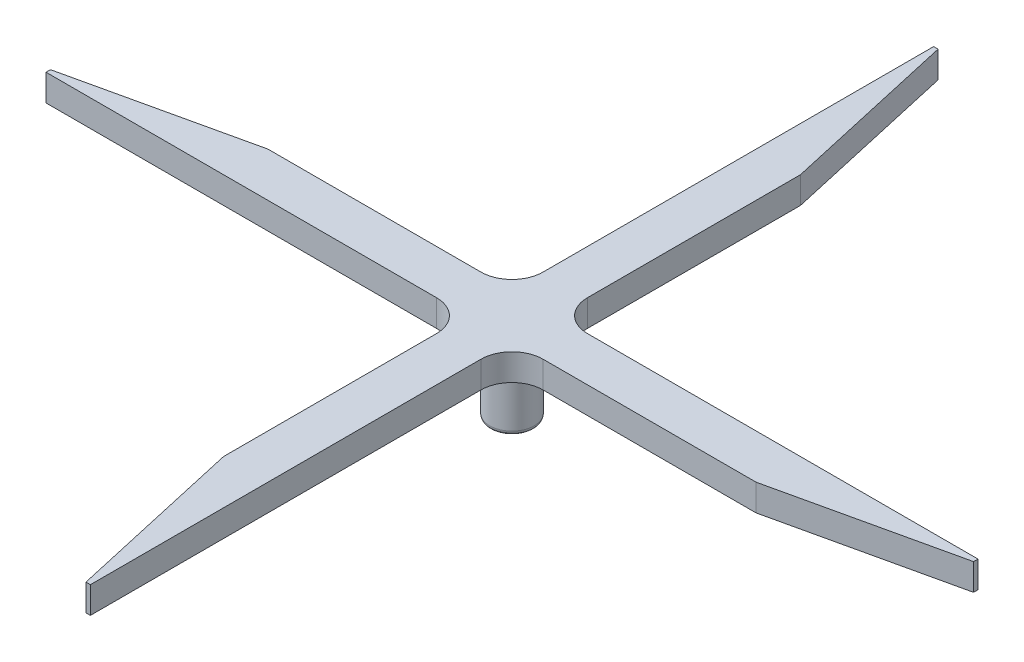
ISO-10303-21;
HEADER;
FILE_DESCRIPTION(('STEP AP214'),'2;1');
FILE_NAME('part.step','',(''),(''),'','','');
FILE_SCHEMA(('AUTOMOTIVE_DESIGN { 1 0 10303 214 1 1 1 1 }'));
ENDSEC;
DATA;
#1=APPLICATION_CONTEXT('core data for automotive mechanical design processes');
#2=APPLICATION_PROTOCOL_DEFINITION('international standard','automotive_design',2000,#1);
#3=PRODUCT_CONTEXT('',#1,'mechanical');
#4=PRODUCT('Part','Part','',(#3));
#5=PRODUCT_RELATED_PRODUCT_CATEGORY('part','',(#4));
#6=PRODUCT_DEFINITION_FORMATION('','',#4);
#7=PRODUCT_DEFINITION_CONTEXT('part definition',#1,'design');
#8=PRODUCT_DEFINITION('design','',#6,#7);
#9=PRODUCT_DEFINITION_SHAPE('','',#8);
#10=(LENGTH_UNIT() NAMED_UNIT(*) SI_UNIT(.MILLI.,.METRE.));
#11=(NAMED_UNIT(*) PLANE_ANGLE_UNIT() SI_UNIT($,.RADIAN.));
#12=(NAMED_UNIT(*) SI_UNIT($,.STERADIAN.) SOLID_ANGLE_UNIT());
#13=UNCERTAINTY_MEASURE_WITH_UNIT(LENGTH_MEASURE(1.E-05),#10,'distance_accuracy_value','');
#14=(GEOMETRIC_REPRESENTATION_CONTEXT(3) GLOBAL_UNCERTAINTY_ASSIGNED_CONTEXT((#13)) GLOBAL_UNIT_ASSIGNED_CONTEXT((#10,
#11,#12)) REPRESENTATION_CONTEXT('',''));
#15=CARTESIAN_POINT('',(0.,0.,0.));
#16=DIRECTION('',(0.,0.,1.));
#17=DIRECTION('',(1.,0.,0.));
#18=AXIS2_PLACEMENT_3D('',#15,#16,#17);
#19=CARTESIAN_POINT('',(-127.,7.62,-6.35));
#20=DIRECTION('',(1.,0.,0.));
#21=DIRECTION('',(0.,0.,-1.));
#22=AXIS2_PLACEMENT_3D('',#19,#20,#21);
#23=PLANE('',#22);
#24=DIRECTION('',(0.,0.,1.));
#25=VECTOR('',#24,1.);
#26=CARTESIAN_POINT('',(-127.,7.62,-6.35));
#27=LINE('',#26,#25);
#28=CARTESIAN_POINT('',(-127.,7.62,5.08000000000007));
#29=VERTEX_POINT('',#28);
#30=CARTESIAN_POINT('',(-127.,7.62,6.35));
#31=VERTEX_POINT('',#30);
#32=EDGE_CURVE('E228',#29,#31,#27,.T.);
#33=ORIENTED_EDGE('',*,*,#32,.F.);
#34=DIRECTION('',(0.,1.,0.));
#35=VECTOR('',#34,1.);
#36=CARTESIAN_POINT('',(-127.,0.,5.08000000000007));
#37=LINE('',#36,#35);
#38=CARTESIAN_POINT('',(-127.,0.,5.08000000000007));
#39=VERTEX_POINT('',#38);
#40=EDGE_CURVE('E647',#39,#29,#37,.T.);
#41=ORIENTED_EDGE('',*,*,#40,.F.);
#42=DIRECTION('',(0.,0.,1.));
#43=VECTOR('',#42,1.);
#44=CARTESIAN_POINT('',(-127.,0.,-6.35));
#45=LINE('',#44,#43);
#46=CARTESIAN_POINT('',(-127.,0.,6.35));
#47=VERTEX_POINT('',#46);
#48=EDGE_CURVE('E591',#39,#47,#45,.T.);
#49=ORIENTED_EDGE('',*,*,#48,.T.);
#50=DIRECTION('',(0.,-1.,0.));
#51=VECTOR('',#50,1.);
#52=CARTESIAN_POINT('',(-127.,7.62,6.35));
#53=LINE('',#52,#51);
#54=EDGE_CURVE('E273',#31,#47,#53,.T.);
#55=ORIENTED_EDGE('',*,*,#54,.F.);
#56=EDGE_LOOP('',(#33,#41,#49,#55));
#57=FACE_BOUND('',#56,.T.);
#58=ADVANCED_FACE('F47',(#57),#23,.F.);
#59=CARTESIAN_POINT('',(-127.,7.62,6.35));
#60=DIRECTION('',(0.,0.,-1.));
#61=DIRECTION('',(-1.,0.,0.));
#62=AXIS2_PLACEMENT_3D('',#59,#60,#61);
#63=PLANE('',#62);
#64=DIRECTION('',(1.,0.,0.));
#65=VECTOR('',#64,1.);
#66=CARTESIAN_POINT('',(-127.,0.,6.35));
#67=LINE('',#66,#65);
#68=CARTESIAN_POINT('',(-15.2400000000001,0.,6.35));
#69=VERTEX_POINT('',#68);
#70=EDGE_CURVE('E594',#47,#69,#67,.T.);
#71=ORIENTED_EDGE('',*,*,#70,.T.);
#72=DIRECTION('',(0.,-1.,0.));
#73=VECTOR('',#72,1.);
#74=CARTESIAN_POINT('',(-15.2400000000001,7.62,6.35));
#75=LINE('',#74,#73);
#76=CARTESIAN_POINT('',(-15.2400000000001,7.62,6.35));
#77=VERTEX_POINT('',#76);
#78=EDGE_CURVE('E269',#77,#69,#75,.T.);
#79=ORIENTED_EDGE('',*,*,#78,.F.);
#80=DIRECTION('',(1.,0.,0.));
#81=VECTOR('',#80,1.);
#82=CARTESIAN_POINT('',(-127.,7.62,6.35));
#83=LINE('',#82,#81);
#84=EDGE_CURVE('E662',#31,#77,#83,.T.);
#85=ORIENTED_EDGE('',*,*,#84,.F.);
#86=ORIENTED_EDGE('',*,*,#54,.T.);
#87=EDGE_LOOP('',(#71,#79,#85,#86));
#88=FACE_BOUND('',#87,.T.);
#89=ADVANCED_FACE('F302',(#88),#63,.F.);
#90=CARTESIAN_POINT('',(-15.24,7.62,15.24));
#91=DIRECTION('',(0.,-1.,0.));
#92=DIRECTION('',(0.,0.,-1.));
#93=AXIS2_PLACEMENT_3D('',#90,#91,#92);
#94=CYLINDRICAL_SURFACE('',#93,8.89);
#95=CARTESIAN_POINT('',(-15.24,0.,15.24));
#96=DIRECTION('',(0.,-1.,0.));
#97=DIRECTION('',(0.,0.,-1.));
#98=AXIS2_PLACEMENT_3D('',#95,#96,#97);
#99=CIRCLE('',#98,8.89);
#100=CARTESIAN_POINT('',(-6.35,0.,15.2400000000001));
#101=VERTEX_POINT('',#100);
#102=EDGE_CURVE('E597',#69,#101,#99,.T.);
#103=ORIENTED_EDGE('',*,*,#102,.T.);
#104=DIRECTION('',(0.,-1.,0.));
#105=VECTOR('',#104,1.);
#106=CARTESIAN_POINT('',(-6.35,7.62,15.2400000000001));
#107=LINE('',#106,#105);
#108=CARTESIAN_POINT('',(-6.35,7.62,15.2400000000001));
#109=VERTEX_POINT('',#108);
#110=EDGE_CURVE('E265',#109,#101,#107,.T.);
#111=ORIENTED_EDGE('',*,*,#110,.F.);
#112=CARTESIAN_POINT('',(-15.24,7.62,15.24));
#113=DIRECTION('',(0.,-1.,0.));
#114=DIRECTION('',(0.,0.,-1.));
#115=AXIS2_PLACEMENT_3D('',#112,#113,#114);
#116=CIRCLE('',#115,8.89);
#117=EDGE_CURVE('E665',#77,#109,#116,.T.);
#118=ORIENTED_EDGE('',*,*,#117,.F.);
#119=ORIENTED_EDGE('',*,*,#78,.T.);
#120=EDGE_LOOP('',(#103,#111,#118,#119));
#121=FACE_BOUND('',#120,.T.);
#122=ADVANCED_FACE('F310',(#121),#94,.F.);
#123=CARTESIAN_POINT('',(-6.35,7.62,15.2400000000001));
#124=DIRECTION('',(1.,0.,0.));
#125=DIRECTION('',(0.,0.,-1.));
#126=AXIS2_PLACEMENT_3D('',#123,#124,#125);
#127=PLANE('',#126);
#128=DIRECTION('',(0.,0.,1.));
#129=VECTOR('',#128,1.);
#130=CARTESIAN_POINT('',(-6.35,0.,15.2400000000001));
#131=LINE('',#130,#129);
#132=CARTESIAN_POINT('',(-6.34999999999999,0.,76.2));
#133=VERTEX_POINT('',#132);
#134=EDGE_CURVE('E600',#101,#133,#131,.T.);
#135=ORIENTED_EDGE('',*,*,#134,.T.);
#136=DIRECTION('',(0.,1.,0.));
#137=VECTOR('',#136,1.);
#138=CARTESIAN_POINT('',(-6.34999999999997,0.,76.2000000000001));
#139=LINE('',#138,#137);
#140=CARTESIAN_POINT('',(-6.34999999999997,7.62,76.2000000000001));
#141=VERTEX_POINT('',#140);
#142=EDGE_CURVE('E63',#133,#141,#139,.T.);
#143=ORIENTED_EDGE('',*,*,#142,.T.);
#144=DIRECTION('',(0.,0.,1.));
#145=VECTOR('',#144,1.);
#146=CARTESIAN_POINT('',(-6.35,7.62,15.2400000000001));
#147=LINE('',#146,#145);
#148=EDGE_CURVE('E668',#109,#141,#147,.T.);
#149=ORIENTED_EDGE('',*,*,#148,.F.);
#150=ORIENTED_EDGE('',*,*,#110,.T.);
#151=EDGE_LOOP('',(#135,#143,#149,#150));
#152=FACE_BOUND('',#151,.T.);
#153=ADVANCED_FACE('F317',(#152),#127,.F.);
#154=CARTESIAN_POINT('',(-6.34999999999998,7.62,127.));
#155=DIRECTION('',(0.,0.,-1.));
#156=DIRECTION('',(-1.,0.,0.));
#157=AXIS2_PLACEMENT_3D('',#154,#155,#156);
#158=PLANE('',#157);
#159=DIRECTION('',(1.,0.,0.));
#160=VECTOR('',#159,1.);
#161=CARTESIAN_POINT('',(-6.34999999999998,7.62,127.));
#162=LINE('',#161,#160);
#163=CARTESIAN_POINT('',(5.08000000000005,7.62,127.));
#164=VERTEX_POINT('',#163);
#165=CARTESIAN_POINT('',(6.35000000000002,7.62,127.));
#166=VERTEX_POINT('',#165);
#167=EDGE_CURVE('E672',#164,#166,#162,.T.);
#168=ORIENTED_EDGE('',*,*,#167,.F.);
#169=DIRECTION('',(0.,1.,0.));
#170=VECTOR('',#169,1.);
#171=CARTESIAN_POINT('',(5.08000000000005,0.,127.));
#172=LINE('',#171,#170);
#173=CARTESIAN_POINT('',(5.08000000000005,0.,127.));
#174=VERTEX_POINT('',#173);
#175=EDGE_CURVE('E636',#174,#164,#172,.T.);
#176=ORIENTED_EDGE('',*,*,#175,.F.);
#177=DIRECTION('',(1.,0.,0.));
#178=VECTOR('',#177,1.);
#179=CARTESIAN_POINT('',(-6.34999999999998,0.,127.));
#180=LINE('',#179,#178);
#181=CARTESIAN_POINT('',(6.35000000000002,0.,127.));
#182=VERTEX_POINT('',#181);
#183=EDGE_CURVE('E604',#174,#182,#180,.T.);
#184=ORIENTED_EDGE('',*,*,#183,.T.);
#185=DIRECTION('',(0.,-1.,0.));
#186=VECTOR('',#185,1.);
#187=CARTESIAN_POINT('',(6.35000000000002,7.62,127.));
#188=LINE('',#187,#186);
#189=EDGE_CURVE('E261',#166,#182,#188,.T.);
#190=ORIENTED_EDGE('',*,*,#189,.F.);
#191=EDGE_LOOP('',(#168,#176,#184,#190));
#192=FACE_BOUND('',#191,.T.);
#193=ADVANCED_FACE('F320',(#192),#158,.F.);
#194=CARTESIAN_POINT('',(6.35000000000001,7.62,15.2400000000001));
#195=DIRECTION('',(-1.,0.,0.));
#196=DIRECTION('',(0.,0.,1.));
#197=AXIS2_PLACEMENT_3D('',#194,#195,#196);
#198=PLANE('',#197);
#199=DIRECTION('',(0.,0.,-1.));
#200=VECTOR('',#199,1.);
#201=CARTESIAN_POINT('',(6.35000000000001,0.,15.2400000000001));
#202=LINE('',#201,#200);
#203=CARTESIAN_POINT('',(6.35000000000001,0.,15.2400000000001));
#204=VERTEX_POINT('',#203);
#205=EDGE_CURVE('E607',#182,#204,#202,.T.);
#206=ORIENTED_EDGE('',*,*,#205,.T.);
#207=DIRECTION('',(0.,-1.,0.));
#208=VECTOR('',#207,1.);
#209=CARTESIAN_POINT('',(6.35000000000001,7.62,15.2400000000001));
#210=LINE('',#209,#208);
#211=CARTESIAN_POINT('',(6.35000000000001,7.62,15.2400000000001));
#212=VERTEX_POINT('',#211);
#213=EDGE_CURVE('E257',#212,#204,#210,.T.);
#214=ORIENTED_EDGE('',*,*,#213,.F.);
#215=DIRECTION('',(0.,0.,-1.));
#216=VECTOR('',#215,1.);
#217=CARTESIAN_POINT('',(6.35000000000001,7.62,15.2400000000001));
#218=LINE('',#217,#216);
#219=EDGE_CURVE('E568',#166,#212,#218,.T.);
#220=ORIENTED_EDGE('',*,*,#219,.F.);
#221=ORIENTED_EDGE('',*,*,#189,.T.);
#222=EDGE_LOOP('',(#206,#214,#220,#221));
#223=FACE_BOUND('',#222,.T.);
#224=ADVANCED_FACE('F324',(#223),#198,.F.);
#225=CARTESIAN_POINT('',(15.24,7.62,15.24));
#226=DIRECTION('',(0.,-1.,0.));
#227=DIRECTION('',(0.,0.,-1.));
#228=AXIS2_PLACEMENT_3D('',#225,#226,#227);
#229=CYLINDRICAL_SURFACE('',#228,8.89);
#230=CARTESIAN_POINT('',(15.24,0.,15.24));
#231=DIRECTION('',(0.,-1.,0.));
#232=DIRECTION('',(0.,0.,-1.));
#233=AXIS2_PLACEMENT_3D('',#230,#231,#232);
#234=CIRCLE('',#233,8.89);
#235=CARTESIAN_POINT('',(15.2400000000001,0.,6.35));
#236=VERTEX_POINT('',#235);
#237=EDGE_CURVE('E610',#204,#236,#234,.T.);
#238=ORIENTED_EDGE('',*,*,#237,.T.);
#239=DIRECTION('',(0.,-1.,0.));
#240=VECTOR('',#239,1.);
#241=CARTESIAN_POINT('',(15.2400000000001,7.62,6.35));
#242=LINE('',#241,#240);
#243=CARTESIAN_POINT('',(15.2400000000001,7.62,6.35));
#244=VERTEX_POINT('',#243);
#245=EDGE_CURVE('E253',#244,#236,#242,.T.);
#246=ORIENTED_EDGE('',*,*,#245,.F.);
#247=CARTESIAN_POINT('',(15.24,7.62,15.24));
#248=DIRECTION('',(0.,-1.,0.));
#249=DIRECTION('',(0.,0.,-1.));
#250=AXIS2_PLACEMENT_3D('',#247,#248,#249);
#251=CIRCLE('',#250,8.89);
#252=EDGE_CURVE('E559',#212,#244,#251,.T.);
#253=ORIENTED_EDGE('',*,*,#252,.F.);
#254=ORIENTED_EDGE('',*,*,#213,.T.);
#255=EDGE_LOOP('',(#238,#246,#253,#254));
#256=FACE_BOUND('',#255,.T.);
#257=ADVANCED_FACE('F328',(#256),#229,.F.);
#258=CARTESIAN_POINT('',(15.2400000000001,7.62,6.35));
#259=DIRECTION('',(0.,0.,-1.));
#260=DIRECTION('',(-1.,0.,0.));
#261=AXIS2_PLACEMENT_3D('',#258,#259,#260);
#262=PLANE('',#261);
#263=DIRECTION('',(1.,0.,0.));
#264=VECTOR('',#263,1.);
#265=CARTESIAN_POINT('',(15.2400000000001,0.,6.35));
#266=LINE('',#265,#264);
#267=CARTESIAN_POINT('',(76.2000000000001,0.,6.35));
#268=VERTEX_POINT('',#267);
#269=EDGE_CURVE('E553',#236,#268,#266,.T.);
#270=ORIENTED_EDGE('',*,*,#269,.T.);
#271=DIRECTION('',(0.,1.,0.));
#272=VECTOR('',#271,1.);
#273=CARTESIAN_POINT('',(76.2,0.,6.35000000000001));
#274=LINE('',#273,#272);
#275=CARTESIAN_POINT('',(76.2,7.62,6.35000000000001));
#276=VERTEX_POINT('',#275);
#277=EDGE_CURVE('E71',#268,#276,#274,.T.);
#278=ORIENTED_EDGE('',*,*,#277,.T.);
#279=DIRECTION('',(1.,0.,0.));
#280=VECTOR('',#279,1.);
#281=CARTESIAN_POINT('',(15.2400000000001,7.62,6.35));
#282=LINE('',#281,#280);
#283=EDGE_CURVE('E551',#244,#276,#282,.T.);
#284=ORIENTED_EDGE('',*,*,#283,.F.);
#285=ORIENTED_EDGE('',*,*,#245,.T.);
#286=EDGE_LOOP('',(#270,#278,#284,#285));
#287=FACE_BOUND('',#286,.T.);
#288=ADVANCED_FACE('F332',(#287),#262,.F.);
#289=CARTESIAN_POINT('',(127.,7.62,-6.35));
#290=DIRECTION('',(-1.,0.,0.));
#291=DIRECTION('',(0.,0.,1.));
#292=AXIS2_PLACEMENT_3D('',#289,#290,#291);
#293=PLANE('',#292);
#294=DIRECTION('',(0.,0.,-1.));
#295=VECTOR('',#294,1.);
#296=CARTESIAN_POINT('',(127.,7.62,-6.35));
#297=LINE('',#296,#295);
#298=CARTESIAN_POINT('',(127.,7.62,-5.08));
#299=VERTEX_POINT('',#298);
#300=CARTESIAN_POINT('',(127.,7.62,-6.35));
#301=VERTEX_POINT('',#300);
#302=EDGE_CURVE('E562',#299,#301,#297,.T.);
#303=ORIENTED_EDGE('',*,*,#302,.F.);
#304=DIRECTION('',(0.,1.,0.));
#305=VECTOR('',#304,1.);
#306=CARTESIAN_POINT('',(127.,0.,-5.08));
#307=LINE('',#306,#305);
#308=CARTESIAN_POINT('',(127.,0.,-5.08));
#309=VERTEX_POINT('',#308);
#310=EDGE_CURVE('E543',#309,#299,#307,.T.);
#311=ORIENTED_EDGE('',*,*,#310,.F.);
#312=DIRECTION('',(0.,0.,-1.));
#313=VECTOR('',#312,1.);
#314=CARTESIAN_POINT('',(127.,0.,-6.35));
#315=LINE('',#314,#313);
#316=CARTESIAN_POINT('',(127.,0.,-6.35));
#317=VERTEX_POINT('',#316);
#318=EDGE_CURVE('E615',#309,#317,#315,.T.);
#319=ORIENTED_EDGE('',*,*,#318,.T.);
#320=DIRECTION('',(0.,-1.,0.));
#321=VECTOR('',#320,1.);
#322=CARTESIAN_POINT('',(127.,7.62,-6.35));
#323=LINE('',#322,#321);
#324=EDGE_CURVE('E249',#301,#317,#323,.T.);
#325=ORIENTED_EDGE('',*,*,#324,.F.);
#326=EDGE_LOOP('',(#303,#311,#319,#325));
#327=FACE_BOUND('',#326,.T.);
#328=ADVANCED_FACE('F336',(#327),#293,.F.);
#329=CARTESIAN_POINT('',(15.2400000000001,7.62,-6.35));
#330=DIRECTION('',(0.,0.,1.));
#331=DIRECTION('',(1.,0.,0.));
#332=AXIS2_PLACEMENT_3D('',#329,#330,#331);
#333=PLANE('',#332);
#334=DIRECTION('',(-1.,0.,0.));
#335=VECTOR('',#334,1.);
#336=CARTESIAN_POINT('',(15.2400000000001,0.,-6.35));
#337=LINE('',#336,#335);
#338=CARTESIAN_POINT('',(15.2400000000001,0.,-6.35));
#339=VERTEX_POINT('',#338);
#340=EDGE_CURVE('E618',#317,#339,#337,.T.);
#341=ORIENTED_EDGE('',*,*,#340,.T.);
#342=DIRECTION('',(0.,-1.,0.));
#343=VECTOR('',#342,1.);
#344=CARTESIAN_POINT('',(15.2400000000001,7.62,-6.35));
#345=LINE('',#344,#343);
#346=CARTESIAN_POINT('',(15.2400000000001,7.62,-6.35));
#347=VERTEX_POINT('',#346);
#348=EDGE_CURVE('E245',#347,#339,#345,.T.);
#349=ORIENTED_EDGE('',*,*,#348,.F.);
#350=DIRECTION('',(-1.,0.,0.));
#351=VECTOR('',#350,1.);
#352=CARTESIAN_POINT('',(15.2400000000001,7.62,-6.35));
#353=LINE('',#352,#351);
#354=EDGE_CURVE('E566',#301,#347,#353,.T.);
#355=ORIENTED_EDGE('',*,*,#354,.F.);
#356=ORIENTED_EDGE('',*,*,#324,.T.);
#357=EDGE_LOOP('',(#341,#349,#355,#356));
#358=FACE_BOUND('',#357,.T.);
#359=ADVANCED_FACE('F340',(#358),#333,.F.);
#360=CARTESIAN_POINT('',(15.24,7.62,-15.24));
#361=DIRECTION('',(0.,-1.,0.));
#362=DIRECTION('',(0.,0.,-1.));
#363=AXIS2_PLACEMENT_3D('',#360,#361,#362);
#364=CYLINDRICAL_SURFACE('',#363,8.89);
#365=CARTESIAN_POINT('',(15.24,0.,-15.24));
#366=DIRECTION('',(0.,-1.,0.));
#367=DIRECTION('',(0.,0.,-1.));
#368=AXIS2_PLACEMENT_3D('',#365,#366,#367);
#369=CIRCLE('',#368,8.89);
#370=CARTESIAN_POINT('',(6.35,0.,-15.2400000000001));
#371=VERTEX_POINT('',#370);
#372=EDGE_CURVE('E218',#339,#371,#369,.T.);
#373=ORIENTED_EDGE('',*,*,#372,.T.);
#374=DIRECTION('',(0.,-1.,0.));
#375=VECTOR('',#374,1.);
#376=CARTESIAN_POINT('',(6.35,7.62,-15.2400000000001));
#377=LINE('',#376,#375);
#378=CARTESIAN_POINT('',(6.35,7.62,-15.2400000000001));
#379=VERTEX_POINT('',#378);
#380=EDGE_CURVE('E241',#379,#371,#377,.T.);
#381=ORIENTED_EDGE('',*,*,#380,.F.);
#382=CARTESIAN_POINT('',(15.24,7.62,-15.24));
#383=DIRECTION('',(0.,-1.,0.));
#384=DIRECTION('',(0.,0.,-1.));
#385=AXIS2_PLACEMENT_3D('',#382,#383,#384);
#386=CIRCLE('',#385,8.89);
#387=EDGE_CURVE('E574',#347,#379,#386,.T.);
#388=ORIENTED_EDGE('',*,*,#387,.F.);
#389=ORIENTED_EDGE('',*,*,#348,.T.);
#390=EDGE_LOOP('',(#373,#381,#388,#389));
#391=FACE_BOUND('',#390,.T.);
#392=ADVANCED_FACE('F344',(#391),#364,.F.);
#393=CARTESIAN_POINT('',(6.34999999999999,7.62,-127.));
#394=DIRECTION('',(-1.,0.,0.));
#395=DIRECTION('',(0.,0.,1.));
#396=AXIS2_PLACEMENT_3D('',#393,#394,#395);
#397=PLANE('',#396);
#398=DIRECTION('',(0.,0.,-1.));
#399=VECTOR('',#398,1.);
#400=CARTESIAN_POINT('',(6.34999999999999,0.,-127.));
#401=LINE('',#400,#399);
#402=CARTESIAN_POINT('',(6.3499999999999,0.,-76.2000000000009));
#403=VERTEX_POINT('',#402);
#404=EDGE_CURVE('E212',#371,#403,#401,.T.);
#405=ORIENTED_EDGE('',*,*,#404,.T.);
#406=DIRECTION('',(0.,1.,0.));
#407=VECTOR('',#406,1.);
#408=CARTESIAN_POINT('',(6.35,0.,-76.2));
#409=LINE('',#408,#407);
#410=CARTESIAN_POINT('',(6.35,7.62,-76.2));
#411=VERTEX_POINT('',#410);
#412=EDGE_CURVE('E190',#403,#411,#409,.T.);
#413=ORIENTED_EDGE('',*,*,#412,.T.);
#414=DIRECTION('',(0.,0.,-1.));
#415=VECTOR('',#414,1.);
#416=CARTESIAN_POINT('',(6.34999999999999,7.62,-127.));
#417=LINE('',#416,#415);
#418=EDGE_CURVE('E577',#379,#411,#417,.T.);
#419=ORIENTED_EDGE('',*,*,#418,.F.);
#420=ORIENTED_EDGE('',*,*,#380,.T.);
#421=EDGE_LOOP('',(#405,#413,#419,#420));
#422=FACE_BOUND('',#421,.T.);
#423=ADVANCED_FACE('F348',(#422),#397,.F.);
#424=CARTESIAN_POINT('',(-6.35000000000001,7.62,-127.));
#425=DIRECTION('',(0.,0.,1.));
#426=DIRECTION('',(1.,0.,0.));
#427=AXIS2_PLACEMENT_3D('',#424,#425,#426);
#428=PLANE('',#427);
#429=DIRECTION('',(-1.,0.,0.));
#430=VECTOR('',#429,1.);
#431=CARTESIAN_POINT('',(-6.35000000000001,7.62,-127.));
#432=LINE('',#431,#430);
#433=CARTESIAN_POINT('',(-5.08000000000001,7.62,-127.));
#434=VERTEX_POINT('',#433);
#435=CARTESIAN_POINT('',(-6.35000000000001,7.62,-127.));
#436=VERTEX_POINT('',#435);
#437=EDGE_CURVE('E204',#434,#436,#432,.T.);
#438=ORIENTED_EDGE('',*,*,#437,.F.);
#439=DIRECTION('',(0.,1.,0.));
#440=VECTOR('',#439,1.);
#441=CARTESIAN_POINT('',(-5.08000000000001,0.,-127.));
#442=LINE('',#441,#440);
#443=CARTESIAN_POINT('',(-5.08000000000001,0.,-127.));
#444=VERTEX_POINT('',#443);
#445=EDGE_CURVE('E187',#444,#434,#442,.T.);
#446=ORIENTED_EDGE('',*,*,#445,.F.);
#447=DIRECTION('',(-1.,0.,0.));
#448=VECTOR('',#447,1.);
#449=CARTESIAN_POINT('',(-6.35000000000001,0.,-127.));
#450=LINE('',#449,#448);
#451=CARTESIAN_POINT('',(-6.35000000000001,0.,-127.));
#452=VERTEX_POINT('',#451);
#453=EDGE_CURVE('E202',#444,#452,#450,.T.);
#454=ORIENTED_EDGE('',*,*,#453,.T.);
#455=DIRECTION('',(0.,-1.,0.));
#456=VECTOR('',#455,1.);
#457=CARTESIAN_POINT('',(-6.35000000000001,7.62,-127.));
#458=LINE('',#457,#456);
#459=EDGE_CURVE('E238',#436,#452,#458,.T.);
#460=ORIENTED_EDGE('',*,*,#459,.F.);
#461=EDGE_LOOP('',(#438,#446,#454,#460));
#462=FACE_BOUND('',#461,.T.);
#463=ADVANCED_FACE('F200',(#462),#428,.F.);
#464=CARTESIAN_POINT('',(-6.35000000000001,7.62,-127.));
#465=DIRECTION('',(1.,0.,0.));
#466=DIRECTION('',(0.,0.,-1.));
#467=AXIS2_PLACEMENT_3D('',#464,#465,#466);
#468=PLANE('',#467);
#469=DIRECTION('',(0.,0.,1.));
#470=VECTOR('',#469,1.);
#471=CARTESIAN_POINT('',(-6.35000000000001,0.,-127.));
#472=LINE('',#471,#470);
#473=CARTESIAN_POINT('',(-6.35,0.,-15.2400000000001));
#474=VERTEX_POINT('',#473);
#475=EDGE_CURVE('E210',#452,#474,#472,.T.);
#476=ORIENTED_EDGE('',*,*,#475,.T.);
#477=DIRECTION('',(0.,-1.,0.));
#478=VECTOR('',#477,1.);
#479=CARTESIAN_POINT('',(-6.35,7.62,-15.2400000000001));
#480=LINE('',#479,#478);
#481=CARTESIAN_POINT('',(-6.35,7.62,-15.2400000000001));
#482=VERTEX_POINT('',#481);
#483=EDGE_CURVE('E233',#482,#474,#480,.T.);
#484=ORIENTED_EDGE('',*,*,#483,.F.);
#485=DIRECTION('',(0.,0.,1.));
#486=VECTOR('',#485,1.);
#487=CARTESIAN_POINT('',(-6.35000000000001,7.62,-127.));
#488=LINE('',#487,#486);
#489=EDGE_CURVE('E582',#436,#482,#488,.T.);
#490=ORIENTED_EDGE('',*,*,#489,.F.);
#491=ORIENTED_EDGE('',*,*,#459,.T.);
#492=EDGE_LOOP('',(#476,#484,#490,#491));
#493=FACE_BOUND('',#492,.T.);
#494=ADVANCED_FACE('F355',(#493),#468,.F.);
#495=CARTESIAN_POINT('',(-15.24,7.62,-15.24));
#496=DIRECTION('',(0.,-1.,0.));
#497=DIRECTION('',(0.,0.,-1.));
#498=AXIS2_PLACEMENT_3D('',#495,#496,#497);
#499=CYLINDRICAL_SURFACE('',#498,8.89);
#500=CARTESIAN_POINT('',(-15.24,0.,-15.24));
#501=DIRECTION('',(0.,-1.,0.));
#502=DIRECTION('',(0.,0.,1.));
#503=AXIS2_PLACEMENT_3D('',#500,#501,#502);
#504=CIRCLE('',#503,8.89);
#505=CARTESIAN_POINT('',(-15.2400000000001,0.,-6.35));
#506=VERTEX_POINT('',#505);
#507=EDGE_CURVE('E216',#474,#506,#504,.T.);
#508=ORIENTED_EDGE('',*,*,#507,.T.);
#509=DIRECTION('',(0.,-1.,0.));
#510=VECTOR('',#509,1.);
#511=CARTESIAN_POINT('',(-15.2400000000001,7.62,-6.35));
#512=LINE('',#511,#510);
#513=CARTESIAN_POINT('',(-15.2400000000001,7.62,-6.35));
#514=VERTEX_POINT('',#513);
#515=EDGE_CURVE('E229',#514,#506,#512,.T.);
#516=ORIENTED_EDGE('',*,*,#515,.F.);
#517=CARTESIAN_POINT('',(-15.24,7.62,-15.24));
#518=DIRECTION('',(0.,-1.,0.));
#519=DIRECTION('',(0.,0.,1.));
#520=AXIS2_PLACEMENT_3D('',#517,#518,#519);
#521=CIRCLE('',#520,8.89);
#522=EDGE_CURVE('E585',#482,#514,#521,.T.);
#523=ORIENTED_EDGE('',*,*,#522,.F.);
#524=ORIENTED_EDGE('',*,*,#483,.T.);
#525=EDGE_LOOP('',(#508,#516,#523,#524));
#526=FACE_BOUND('',#525,.T.);
#527=ADVANCED_FACE('F358',(#526),#499,.F.);
#528=CARTESIAN_POINT('',(-127.,7.62,-6.35));
#529=DIRECTION('',(0.,0.,1.));
#530=DIRECTION('',(1.,0.,0.));
#531=AXIS2_PLACEMENT_3D('',#528,#529,#530);
#532=PLANE('',#531);
#533=DIRECTION('',(-1.,0.,0.));
#534=VECTOR('',#533,1.);
#535=CARTESIAN_POINT('',(-127.,0.,-6.35));
#536=LINE('',#535,#534);
#537=CARTESIAN_POINT('',(-76.2000000000001,0.,-6.34999999999997));
#538=VERTEX_POINT('',#537);
#539=EDGE_CURVE('E224',#506,#538,#536,.T.);
#540=ORIENTED_EDGE('',*,*,#539,.T.);
#541=DIRECTION('',(0.,1.,0.));
#542=VECTOR('',#541,1.);
#543=CARTESIAN_POINT('',(-76.2,0.,-6.34999999999994));
#544=LINE('',#543,#542);
#545=CARTESIAN_POINT('',(-76.2,7.62,-6.34999999999994));
#546=VERTEX_POINT('',#545);
#547=EDGE_CURVE('E651',#538,#546,#544,.T.);
#548=ORIENTED_EDGE('',*,*,#547,.T.);
#549=DIRECTION('',(-1.,0.,0.));
#550=VECTOR('',#549,1.);
#551=CARTESIAN_POINT('',(-127.,7.62,-6.35));
#552=LINE('',#551,#550);
#553=EDGE_CURVE('E234',#514,#546,#552,.T.);
#554=ORIENTED_EDGE('',*,*,#553,.F.);
#555=ORIENTED_EDGE('',*,*,#515,.T.);
#556=EDGE_LOOP('',(#540,#548,#554,#555));
#557=FACE_BOUND('',#556,.T.);
#558=ADVANCED_FACE('F361',(#557),#532,.F.);
#559=CARTESIAN_POINT('',(-15.24,7.62,15.24));
#560=DIRECTION('',(0.,-1.,0.));
#561=DIRECTION('',(0.,0.,-1.));
#562=AXIS2_PLACEMENT_3D('',#559,#560,#561);
#563=PLANE('',#562);
#564=ORIENTED_EDGE('',*,*,#418,.T.);
#565=DIRECTION('',(0.219512195121951,0.,0.975609756097561));
#566=VECTOR('',#565,1.);
#567=CARTESIAN_POINT('',(-5.08000000000001,7.62,-127.));
#568=LINE('',#567,#566);
#569=EDGE_CURVE('E196',#434,#411,#568,.T.);
#570=ORIENTED_EDGE('',*,*,#569,.F.);
#571=ORIENTED_EDGE('',*,*,#437,.T.);
#572=ORIENTED_EDGE('',*,*,#489,.T.);
#573=ORIENTED_EDGE('',*,*,#522,.T.);
#574=ORIENTED_EDGE('',*,*,#553,.T.);
#575=DIRECTION('',(0.975609756097561,0.,-0.219512195121952));
#576=VECTOR('',#575,1.);
#577=CARTESIAN_POINT('',(-127.,7.62,5.08000000000007));
#578=LINE('',#577,#576);
#579=EDGE_CURVE('E642',#29,#546,#578,.T.);
#580=ORIENTED_EDGE('',*,*,#579,.F.);
#581=ORIENTED_EDGE('',*,*,#32,.T.);
#582=ORIENTED_EDGE('',*,*,#84,.T.);
#583=ORIENTED_EDGE('',*,*,#117,.T.);
#584=ORIENTED_EDGE('',*,*,#148,.T.);
#585=DIRECTION('',(-0.219512195121952,0.,-0.975609756097561));
#586=VECTOR('',#585,1.);
#587=CARTESIAN_POINT('',(5.08000000000005,7.62,127.));
#588=LINE('',#587,#586);
#589=EDGE_CURVE('E555',#164,#141,#588,.T.);
#590=ORIENTED_EDGE('',*,*,#589,.F.);
#591=ORIENTED_EDGE('',*,*,#167,.T.);
#592=ORIENTED_EDGE('',*,*,#219,.T.);
#593=ORIENTED_EDGE('',*,*,#252,.T.);
#594=ORIENTED_EDGE('',*,*,#283,.T.);
#595=DIRECTION('',(-0.975609756097561,0.,0.219512195121952));
#596=VECTOR('',#595,1.);
#597=CARTESIAN_POINT('',(127.,7.62,-5.08));
#598=LINE('',#597,#596);
#599=EDGE_CURVE('E541',#299,#276,#598,.T.);
#600=ORIENTED_EDGE('',*,*,#599,.F.);
#601=ORIENTED_EDGE('',*,*,#302,.T.);
#602=ORIENTED_EDGE('',*,*,#354,.T.);
#603=ORIENTED_EDGE('',*,*,#387,.T.);
#604=EDGE_LOOP('',(#564,#570,#571,#572,#573,#574,#580,#581,#582,#583,#584,#590,#591,#592,#593,
#594,#600,#601,#602,#603));
#605=FACE_BOUND('',#604,.T.);
#606=ADVANCED_FACE('F365',(#605),#563,.F.);
#607=CARTESIAN_POINT('',(-15.24,0.,15.24));
#608=DIRECTION('',(0.,-1.,0.));
#609=DIRECTION('',(0.,0.,-1.));
#610=AXIS2_PLACEMENT_3D('',#607,#608,#609);
#611=PLANE('',#610);
#612=CARTESIAN_POINT('',(0.,0.,0.));
#613=DIRECTION('',(0.,-1.,0.));
#614=DIRECTION('',(0.,0.,-1.));
#615=AXIS2_PLACEMENT_3D('',#612,#613,#614);
#616=CIRCLE('',#615,7.62);
#617=CARTESIAN_POINT('',(0.,0.,-7.62));
#618=VERTEX_POINT('',#617);
#619=EDGE_CURVE('E281',#618,#618,#616,.F.);
#620=ORIENTED_EDGE('',*,*,#619,.T.);
#621=EDGE_LOOP('',(#620));
#622=FACE_BOUND('',#621,.T.);
#623=DIRECTION('',(0.219512195121951,0.,0.975609756097561));
#624=VECTOR('',#623,1.);
#625=CARTESIAN_POINT('',(-5.08000000000001,0.,-127.));
#626=LINE('',#625,#624);
#627=EDGE_CURVE('E184',#444,#403,#626,.T.);
#628=ORIENTED_EDGE('',*,*,#627,.T.);
#629=ORIENTED_EDGE('',*,*,#404,.F.);
#630=ORIENTED_EDGE('',*,*,#372,.F.);
#631=ORIENTED_EDGE('',*,*,#340,.F.);
#632=ORIENTED_EDGE('',*,*,#318,.F.);
#633=DIRECTION('',(-0.975609756097561,0.,0.219512195121952));
#634=VECTOR('',#633,1.);
#635=CARTESIAN_POINT('',(127.,0.,-5.08));
#636=LINE('',#635,#634);
#637=EDGE_CURVE('E547',#309,#268,#636,.T.);
#638=ORIENTED_EDGE('',*,*,#637,.T.);
#639=ORIENTED_EDGE('',*,*,#269,.F.);
#640=ORIENTED_EDGE('',*,*,#237,.F.);
#641=ORIENTED_EDGE('',*,*,#205,.F.);
#642=ORIENTED_EDGE('',*,*,#183,.F.);
#643=DIRECTION('',(-0.219512195121952,0.,-0.975609756097561));
#644=VECTOR('',#643,1.);
#645=CARTESIAN_POINT('',(5.08000000000005,0.,127.));
#646=LINE('',#645,#644);
#647=EDGE_CURVE('E639',#174,#133,#646,.T.);
#648=ORIENTED_EDGE('',*,*,#647,.T.);
#649=ORIENTED_EDGE('',*,*,#134,.F.);
#650=ORIENTED_EDGE('',*,*,#102,.F.);
#651=ORIENTED_EDGE('',*,*,#70,.F.);
#652=ORIENTED_EDGE('',*,*,#48,.F.);
#653=DIRECTION('',(0.975609756097561,0.,-0.219512195121952));
#654=VECTOR('',#653,1.);
#655=CARTESIAN_POINT('',(-127.,0.,5.08000000000007));
#656=LINE('',#655,#654);
#657=EDGE_CURVE('E650',#39,#538,#656,.T.);
#658=ORIENTED_EDGE('',*,*,#657,.T.);
#659=ORIENTED_EDGE('',*,*,#539,.F.);
#660=ORIENTED_EDGE('',*,*,#507,.F.);
#661=ORIENTED_EDGE('',*,*,#475,.F.);
#662=ORIENTED_EDGE('',*,*,#453,.F.);
#663=EDGE_LOOP('',(#628,#629,#630,#631,#632,#638,#639,#640,#641,#642,#648,#649,#650,#651,#652,
#658,#659,#660,#661,#662));
#664=FACE_BOUND('',#663,.T.);
#665=ADVANCED_FACE('F208',(#622,#664),#611,.T.);
#666=CARTESIAN_POINT('',(-127.,0.,5.08000000000007));
#667=DIRECTION('',(0.219512195121952,0.,0.975609756097561));
#668=DIRECTION('',(0.975609756097561,0.,-0.219512195121952));
#669=AXIS2_PLACEMENT_3D('',#666,#667,#668);
#670=PLANE('',#669);
#671=ORIENTED_EDGE('',*,*,#579,.T.);
#672=ORIENTED_EDGE('',*,*,#547,.F.);
#673=ORIENTED_EDGE('',*,*,#657,.F.);
#674=ORIENTED_EDGE('',*,*,#40,.T.);
#675=EDGE_LOOP('',(#671,#672,#673,#674));
#676=FACE_BOUND('',#675,.T.);
#677=ADVANCED_FACE('F369',(#676),#670,.F.);
#678=CARTESIAN_POINT('',(5.08000000000005,0.,127.));
#679=DIRECTION('',(0.975609756097561,0.,-0.219512195121951));
#680=DIRECTION('',(-0.219512195121952,0.,-0.975609756097561));
#681=AXIS2_PLACEMENT_3D('',#678,#679,#680);
#682=PLANE('',#681);
#683=ORIENTED_EDGE('',*,*,#589,.T.);
#684=ORIENTED_EDGE('',*,*,#142,.F.);
#685=ORIENTED_EDGE('',*,*,#647,.F.);
#686=ORIENTED_EDGE('',*,*,#175,.T.);
#687=EDGE_LOOP('',(#683,#684,#685,#686));
#688=FACE_BOUND('',#687,.T.);
#689=ADVANCED_FACE('F376',(#688),#682,.F.);
#690=CARTESIAN_POINT('',(127.,0.,-5.08));
#691=DIRECTION('',(-0.219512195121952,0.,-0.975609756097561));
#692=DIRECTION('',(-0.975609756097561,0.,0.219512195121952));
#693=AXIS2_PLACEMENT_3D('',#690,#691,#692);
#694=PLANE('',#693);
#695=ORIENTED_EDGE('',*,*,#599,.T.);
#696=ORIENTED_EDGE('',*,*,#277,.F.);
#697=ORIENTED_EDGE('',*,*,#637,.F.);
#698=ORIENTED_EDGE('',*,*,#310,.T.);
#699=EDGE_LOOP('',(#695,#696,#697,#698));
#700=FACE_BOUND('',#699,.T.);
#701=ADVANCED_FACE('F380',(#700),#694,.F.);
#702=CARTESIAN_POINT('',(-5.08000000000001,0.,-127.));
#703=DIRECTION('',(-0.975609756097561,0.,0.219512195121951));
#704=DIRECTION('',(0.219512195121951,0.,0.975609756097561));
#705=AXIS2_PLACEMENT_3D('',#702,#703,#704);
#706=PLANE('',#705);
#707=ORIENTED_EDGE('',*,*,#569,.T.);
#708=ORIENTED_EDGE('',*,*,#412,.F.);
#709=ORIENTED_EDGE('',*,*,#627,.F.);
#710=ORIENTED_EDGE('',*,*,#445,.T.);
#711=EDGE_LOOP('',(#707,#708,#709,#710));
#712=FACE_BOUND('',#711,.T.);
#713=ADVANCED_FACE('F186',(#712),#706,.F.);
#714=CARTESIAN_POINT('',(0.,-17.78,0.));
#715=DIRECTION('',(0.,1.,0.));
#716=DIRECTION('',(0.,0.,1.));
#717=AXIS2_PLACEMENT_3D('',#714,#715,#716);
#718=CYLINDRICAL_SURFACE('',#717,6.35);
#719=CARTESIAN_POINT('',(0.,-16.51,0.));
#720=DIRECTION('',(0.,1.,0.));
#721=DIRECTION('',(0.,0.,1.));
#722=AXIS2_PLACEMENT_3D('',#719,#720,#721);
#723=CIRCLE('',#722,6.35);
#724=CARTESIAN_POINT('',(0.,-16.51,6.35));
#725=VERTEX_POINT('',#724);
#726=EDGE_CURVE('E56',#725,#725,#723,.T.);
#727=ORIENTED_EDGE('',*,*,#726,.T.);
#728=EDGE_LOOP('',(#727));
#729=FACE_BOUND('',#728,.T.);
#730=CARTESIAN_POINT('',(0.,-1.27,0.));
#731=DIRECTION('',(0.,-1.,0.));
#732=DIRECTION('',(0.,0.,-1.));
#733=AXIS2_PLACEMENT_3D('',#730,#731,#732);
#734=CIRCLE('',#733,6.35);
#735=CARTESIAN_POINT('',(0.,-1.27,-6.35));
#736=VERTEX_POINT('',#735);
#737=EDGE_CURVE('E277',#736,#736,#734,.T.);
#738=ORIENTED_EDGE('',*,*,#737,.T.);
#739=EDGE_LOOP('',(#738));
#740=FACE_BOUND('',#739,.T.);
#741=ADVANCED_FACE('F288',(#729,#740),#718,.T.);
#742=CARTESIAN_POINT('',(0.,-17.78,0.));
#743=DIRECTION('',(0.,1.,0.));
#744=DIRECTION('',(0.,0.,1.));
#745=AXIS2_PLACEMENT_3D('',#742,#743,#744);
#746=PLANE('',#745);
#747=CARTESIAN_POINT('',(0.,-17.78,0.));
#748=DIRECTION('',(0.,1.,0.));
#749=DIRECTION('',(0.,0.,1.));
#750=AXIS2_PLACEMENT_3D('',#747,#748,#749);
#751=CIRCLE('',#750,5.08);
#752=CARTESIAN_POINT('',(0.,-17.78,5.08));
#753=VERTEX_POINT('',#752);
#754=EDGE_CURVE('E11',#753,#753,#751,.F.);
#755=ORIENTED_EDGE('',*,*,#754,.T.);
#756=EDGE_LOOP('',(#755));
#757=FACE_BOUND('',#756,.T.);
#758=ADVANCED_FACE('F298',(#757),#746,.F.);
#759=CARTESIAN_POINT('',(0.,-1.27,0.));
#760=DIRECTION('',(0.,-1.,0.));
#761=DIRECTION('',(0.,0.,-1.));
#762=AXIS2_PLACEMENT_3D('',#759,#760,#761);
#763=TOROIDAL_SURFACE('',#762,7.62,1.27);
#764=ORIENTED_EDGE('',*,*,#619,.F.);
#765=EDGE_LOOP('',(#764));
#766=FACE_BOUND('',#765,.T.);
#767=ORIENTED_EDGE('',*,*,#737,.F.);
#768=EDGE_LOOP('',(#767));
#769=FACE_BOUND('',#768,.T.);
#770=ADVANCED_FACE('F292',(#766,#769),#763,.F.);
#771=CARTESIAN_POINT('',(0.,-16.51,0.));
#772=DIRECTION('',(0.,1.,0.));
#773=DIRECTION('',(0.,0.,1.));
#774=AXIS2_PLACEMENT_3D('',#771,#772,#773);
#775=TOROIDAL_SURFACE('',#774,5.08,1.27);
#776=ORIENTED_EDGE('',*,*,#754,.F.);
#777=EDGE_LOOP('',(#776));
#778=FACE_BOUND('',#777,.T.);
#779=ORIENTED_EDGE('',*,*,#726,.F.);
#780=EDGE_LOOP('',(#779));
#781=FACE_BOUND('',#780,.T.);
#782=ADVANCED_FACE('F49',(#778,#781),#775,.T.);
#783=CLOSED_SHELL('',(#58,#89,#122,#153,#193,#224,#257,#288,#328,#359,#392,#423,#463,#494,#527,
#558,#606,#665,#677,#689,#701,#713,#741,#758,#770,#782));
#784=MANIFOLD_SOLID_BREP('B2',#783);
#785=ADVANCED_BREP_SHAPE_REPRESENTATION('',(#18,#784),#14);
#786=SHAPE_DEFINITION_REPRESENTATION(#9,#785);
ENDSEC;
END-ISO-10303-21;
